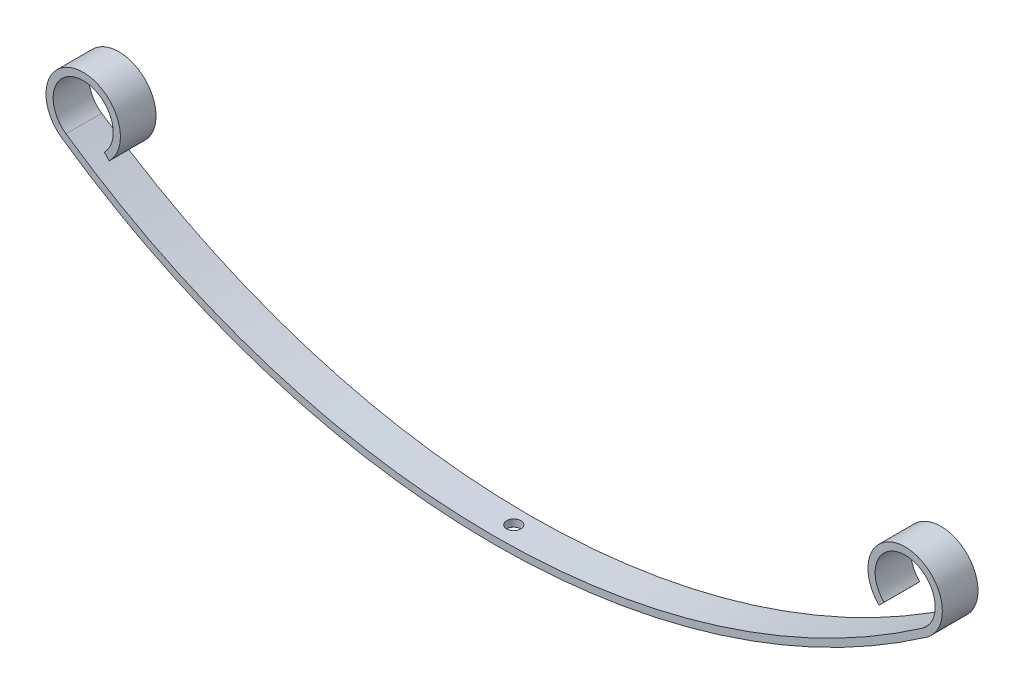
ISO-10303-21;
HEADER;
FILE_DESCRIPTION(('STEP AP214'),'2;1');
FILE_NAME('part.step','',(''),(''),'','','');
FILE_SCHEMA(('AUTOMOTIVE_DESIGN { 1 0 10303 214 1 1 1 1 }'));
ENDSEC;
DATA;
#1=APPLICATION_CONTEXT('core data for automotive mechanical design processes');
#2=APPLICATION_PROTOCOL_DEFINITION('international standard','automotive_design',2000,#1);
#3=PRODUCT_CONTEXT('',#1,'mechanical');
#4=PRODUCT('Part','Part','',(#3));
#5=PRODUCT_RELATED_PRODUCT_CATEGORY('part','',(#4));
#6=PRODUCT_DEFINITION_FORMATION('','',#4);
#7=PRODUCT_DEFINITION_CONTEXT('part definition',#1,'design');
#8=PRODUCT_DEFINITION('design','',#6,#7);
#9=PRODUCT_DEFINITION_SHAPE('','',#8);
#10=(LENGTH_UNIT() NAMED_UNIT(*) SI_UNIT(.MILLI.,.METRE.));
#11=(NAMED_UNIT(*) PLANE_ANGLE_UNIT() SI_UNIT($,.RADIAN.));
#12=(NAMED_UNIT(*) SI_UNIT($,.STERADIAN.) SOLID_ANGLE_UNIT());
#13=UNCERTAINTY_MEASURE_WITH_UNIT(LENGTH_MEASURE(1.E-05),#10,'distance_accuracy_value','');
#14=(GEOMETRIC_REPRESENTATION_CONTEXT(3) GLOBAL_UNCERTAINTY_ASSIGNED_CONTEXT((#13)) GLOBAL_UNIT_ASSIGNED_CONTEXT((#10,
#11,#12)) REPRESENTATION_CONTEXT('',''));
#15=CARTESIAN_POINT('',(0.,0.,0.));
#16=DIRECTION('',(0.,0.,1.));
#17=DIRECTION('',(1.,0.,0.));
#18=AXIS2_PLACEMENT_3D('',#15,#16,#17);
#19=CARTESIAN_POINT('',(-575.940503999726,-827.131576476279,50.));
#20=DIRECTION('',(0.,0.,-1.));
#21=DIRECTION('',(-1.,0.,0.));
#22=AXIS2_PLACEMENT_3D('',#19,#20,#21);
#23=CYLINDRICAL_SURFACE('',#22,52.1041180004789);
#24=CARTESIAN_POINT('',(-575.940503999726,-827.131576476279,0.));
#25=DIRECTION('',(0.,0.,1.));
#26=DIRECTION('',(1.,0.,0.));
#27=AXIS2_PLACEMENT_3D('',#24,#25,#26);
#28=CIRCLE('',#27,52.1041180004789);
#29=CARTESIAN_POINT('',(-539.348809345901,-864.224527221252,0.));
#30=VERTEX_POINT('',#29);
#31=CARTESIAN_POINT('',(-605.714285714286,-869.890915047187,0.));
#32=VERTEX_POINT('',#31);
#33=EDGE_CURVE('E144',#30,#32,#28,.T.);
#34=ORIENTED_EDGE('',*,*,#33,.T.);
#35=DIRECTION('',(0.,0.,-1.));
#36=VECTOR('',#35,1.);
#37=CARTESIAN_POINT('',(-605.714285714286,-869.890915047187,50.));
#38=LINE('',#37,#36);
#39=CARTESIAN_POINT('',(-605.714285714286,-869.890915047187,50.));
#40=VERTEX_POINT('',#39);
#41=EDGE_CURVE('E11',#40,#32,#38,.T.);
#42=ORIENTED_EDGE('',*,*,#41,.F.);
#43=CARTESIAN_POINT('',(-575.940503999726,-827.131576476279,50.));
#44=DIRECTION('',(0.,0.,1.));
#45=DIRECTION('',(1.,0.,0.));
#46=AXIS2_PLACEMENT_3D('',#43,#44,#45);
#47=CIRCLE('',#46,52.1041180004789);
#48=CARTESIAN_POINT('',(-539.348809345901,-864.224527221252,50.));
#49=VERTEX_POINT('',#48);
#50=EDGE_CURVE('E171',#49,#40,#47,.T.);
#51=ORIENTED_EDGE('',*,*,#50,.F.);
#52=DIRECTION('',(0.,0.,-1.));
#53=VECTOR('',#52,1.);
#54=CARTESIAN_POINT('',(-539.348809345901,-864.224527221252,50.));
#55=LINE('',#54,#53);
#56=EDGE_CURVE('E140',#49,#30,#55,.T.);
#57=ORIENTED_EDGE('',*,*,#56,.T.);
#58=EDGE_LOOP('',(#34,#42,#51,#57));
#59=FACE_BOUND('',#58,.T.);
#60=ADVANCED_FACE('F39',(#59),#23,.T.);
#61=CARTESIAN_POINT('',(0.,0.,50.));
#62=DIRECTION('',(0.,0.,-1.));
#63=DIRECTION('',(-1.,0.,0.));
#64=AXIS2_PLACEMENT_3D('',#61,#62,#63);
#65=CYLINDRICAL_SURFACE('',#64,1060.);
#66=CARTESIAN_POINT('',(0.,-1060.,32.5));
#67=CARTESIAN_POINT('',(0.280946584348206,-1060.00000005311,32.5000020220934));
#68=CARTESIAN_POINT('',(0.56186000698558,-1059.99988806992,32.4881554885509));
#69=CARTESIAN_POINT('',(1.12178384017967,-1059.99944337889,32.4408520981594));
#70=CARTESIAN_POINT('',(1.40079373100566,-1059.99911061302,32.4053890348243));
#71=CARTESIAN_POINT('',(1.95512691926414,-1059.99823320531,32.3110456503398));
#72=CARTESIAN_POINT('',(2.23044597331775,-1059.99768833816,32.2521404262339));
#73=CARTESIAN_POINT('',(2.77514481562961,-1059.996402234,32.1113319083847));
#74=CARTESIAN_POINT('',(3.04452449859756,-1059.99566099352,32.0294282072885));
#75=CARTESIAN_POINT('',(3.5752887959038,-1059.9940036209,31.8432523644932));
#76=CARTESIAN_POINT('',(3.83667730994195,-1059.99308757571,31.7389913389032));
#77=CARTESIAN_POINT('',(4.34974481181648,-1059.99110634953,31.5088165525777));
#78=CARTESIAN_POINT('',(4.60142364640466,-1059.9900411662,31.382902450262));
#79=CARTESIAN_POINT('',(5.09321722992586,-1059.98779219393,31.1103516290593));
#80=CARTESIAN_POINT('',(5.33333480554242,-1059.98660843421,30.9637200103765));
#81=CARTESIAN_POINT('',(5.8003606571583,-1059.9841557098,30.6507563684889));
#82=CARTESIAN_POINT('',(6.02726921450707,-1059.98288674693,30.4844247651191));
#83=CARTESIAN_POINT('',(6.46630145618245,-1059.98029941738,30.1332156423847));
#84=CARTESIAN_POINT('',(6.67842302462288,-1059.97898104367,29.9483354780811));
#85=CARTESIAN_POINT('',(7.08633806907873,-1059.97633248349,29.561363072658));
#86=CARTESIAN_POINT('',(7.28213152827135,-1059.975002297,29.3592708138054));
#87=CARTESIAN_POINT('',(7.65600563784012,-1059.97236781821,28.9393027189671));
#88=CARTESIAN_POINT('',(7.8340855975412,-1059.97106352692,28.7214262681048));
#89=CARTESIAN_POINT('',(8.17125798978058,-1059.96851791795,28.2714456419832));
#90=CARTESIAN_POINT('',(8.33035042594166,-1059.96727660027,28.0393414694386));
#91=CARTESIAN_POINT('',(8.62841675297272,-1059.96489217678,27.5625553311994));
#92=CARTESIAN_POINT('',(8.76739064149245,-1059.963749071,27.3178733640354));
#93=CARTESIAN_POINT('',(9.02423174592911,-1059.96159352313,26.8176711092513));
#94=CARTESIAN_POINT('',(9.14209896111197,-1059.96058108105,26.5621508212542));
#95=CARTESIAN_POINT('',(9.35588838032539,-1059.95871560566,26.0420890694925));
#96=CARTESIAN_POINT('',(9.45181063206887,-1059.957862572,25.7775476253433));
#97=CARTESIAN_POINT('',(9.62102834409218,-1059.95634012899,25.2413238128445));
#98=CARTESIAN_POINT('',(9.69432380511083,-1059.95567071964,24.969641444728));
#99=CARTESIAN_POINT('',(9.81776495300685,-1059.95453454668,24.4210751591308));
#100=CARTESIAN_POINT('',(9.86791129425824,-1059.95406777733,24.1441913889122));
#101=CARTESIAN_POINT('',(9.94470064402974,-1059.95335010869,23.5871833899874));
#102=CARTESIAN_POINT('',(9.9713436529791,-1059.95309920939,23.3070591613404));
#103=CARTESIAN_POINT('',(10.0009368315469,-1059.9528204042,22.7455624456118));
#104=CARTESIAN_POINT('',(10.0038870484492,-1059.95279249787,22.4641899610224));
#105=CARTESIAN_POINT('',(9.98607378550728,-1059.9529604699,21.9021967050847));
#106=CARTESIAN_POINT('',(9.96531030609027,-1059.95315634825,21.6215759337227));
#107=CARTESIAN_POINT('',(9.90021834436419,-1059.95376631874,21.0630900864696));
#108=CARTESIAN_POINT('',(9.85589060514177,-1059.95418040401,20.7852249239632));
#109=CARTESIAN_POINT('',(9.74398580294951,-1059.95521502892,20.2342167248068));
#110=CARTESIAN_POINT('',(9.67640874052277,-1059.95583556856,19.9610736880465));
#111=CARTESIAN_POINT('',(9.51848572371814,-1059.95726548699,19.4214512112829));
#112=CARTESIAN_POINT('',(9.42813974349648,-1059.958074866,19.1549717788434));
#113=CARTESIAN_POINT('',(9.22532131348973,-1059.95985948679,18.6305711663604));
#114=CARTESIAN_POINT('',(9.11284886315724,-1059.96083472857,18.3726499865285));
#115=CARTESIAN_POINT('',(8.8665751949722,-1059.96292340768,17.8671953037659));
#116=CARTESIAN_POINT('',(8.73277363926302,-1059.96403684719,17.6196619654586));
#117=CARTESIAN_POINT('',(8.44479429713416,-1059.96637030295,17.1367468776052));
#118=CARTESIAN_POINT('',(8.29061651058448,-1059.9675903192,16.9013651281366));
#119=CARTESIAN_POINT('',(7.96298078682747,-1059.97010229707,16.4444264090993));
#120=CARTESIAN_POINT('',(7.78952285308146,-1059.97139425868,16.2228694370487));
#121=CARTESIAN_POINT('',(7.4245598551457,-1059.97401345524,15.7951550835713));
#122=CARTESIAN_POINT('',(7.23305479046283,-1059.97534069018,15.5889977025654));
#123=CARTESIAN_POINT('',(6.83335098118503,-1059.97799281239,15.1935401938286));
#124=CARTESIAN_POINT('',(6.62515158345991,-1059.97931769955,15.0042407262397));
#125=CARTESIAN_POINT('',(6.19354566028855,-1059.98192746531,14.6438538228687));
#126=CARTESIAN_POINT('',(5.97013913441568,-1059.98321234391,14.4727663875976));
#127=CARTESIAN_POINT('',(5.50970705525377,-1059.98570561966,14.1500198242902));
#128=CARTESIAN_POINT('',(5.27268149991302,-1059.98691401681,13.998360699181));
#129=CARTESIAN_POINT('',(4.7866963677902,-1059.98922002738,13.7155490281529));
#130=CARTESIAN_POINT('',(4.53773679115306,-1059.9903176408,13.584396481985));
#131=CARTESIAN_POINT('',(4.02965324006816,-1059.99237092721,13.3435303648615));
#132=CARTESIAN_POINT('',(3.77052925630749,-1059.99332660007,13.2338168135494));
#133=CARTESIAN_POINT('',(3.24395929545183,-1059.99506887533,13.0366089692603));
#134=CARTESIAN_POINT('',(2.97651331831506,-1059.99585547773,12.9491146763949));
#135=CARTESIAN_POINT('',(2.43520087718173,-1059.99723728213,12.7969675543235));
#136=CARTESIAN_POINT('',(2.16133441486457,-1059.99783248418,12.7323147191431));
#137=CARTESIAN_POINT('',(1.6091280955505,-1059.99881459158,12.6263102664249));
#138=CARTESIAN_POINT('',(1.33078823870042,-1059.99920149693,12.5849586481223));
#139=CARTESIAN_POINT('',(0.77162494237483,-1059.99975601669,12.5258518556675));
#140=CARTESIAN_POINT('',(0.490801599132531,-1059.99992363955,12.5080957712042));
#141=CARTESIAN_POINT('',(-0.071342710693692,-1060.00003486381,12.4963033565812));
#142=CARTESIAN_POINT('',(-0.352663677264907,-1059.9999784652,12.5022670258157));
#143=CARTESIAN_POINT('',(-0.91380311134412,-1059.99964324747,12.5378717052939));
#144=CARTESIAN_POINT('',(-1.19362157895722,-1059.99936442837,12.5675127138814));
#145=CARTESIAN_POINT('',(-1.74976663636781,-1059.99859228428,12.6502612785661));
#146=CARTESIAN_POINT('',(-2.02609322617277,-1059.9980989593,12.7033688346131));
#147=CARTESIAN_POINT('',(-2.57328511112292,-1059.99691181759,12.8326716784161));
#148=CARTESIAN_POINT('',(-2.84415050369338,-1059.99621800443,12.9088665539154));
#149=CARTESIAN_POINT('',(-3.3784995128294,-1059.99464957655,13.0838025768682));
#150=CARTESIAN_POINT('',(-3.64198312951571,-1059.99377496182,13.1825437239529));
#151=CARTESIAN_POINT('',(-4.15969558860484,-1059.99186975591,13.4018702365201));
#152=CARTESIAN_POINT('',(-4.41392443068157,-1059.99083916473,13.5224556027723));
#153=CARTESIAN_POINT('',(-4.91132018727455,-1059.98865125796,13.7846132433663));
#154=CARTESIAN_POINT('',(-5.15448710144171,-1059.98749394237,13.9261855183705));
#155=CARTESIAN_POINT('',(-5.62803778503295,-1059.98508539847,14.2293151696099));
#156=CARTESIAN_POINT('',(-5.85842116327858,-1059.98383416729,14.3908731569236));
#157=CARTESIAN_POINT('',(-6.30475909014677,-1059.98127333946,14.7328222943886));
#158=CARTESIAN_POINT('',(-6.52071363850222,-1059.97996374281,14.9132134448885));
#159=CARTESIAN_POINT('',(-6.93665894786419,-1059.97732335599,15.2915466762952));
#160=CARTESIAN_POINT('',(-7.13664969940709,-1059.97599256581,15.4894887676064));
#161=CARTESIAN_POINT('',(-7.5192456514605,-1059.97334756745,15.9015167263907));
#162=CARTESIAN_POINT('',(-7.70185085167683,-1059.97203335926,16.1156025941369));
#163=CARTESIAN_POINT('',(-8.04838312062709,-1059.96945878853,16.5584033356973));
#164=CARTESIAN_POINT('',(-8.21230959677797,-1059.96819842769,16.7871186732725));
#165=CARTESIAN_POINT('',(-8.52031230477512,-1059.96576737509,17.2575463569666));
#166=CARTESIAN_POINT('',(-8.66438853614721,-1059.96459668332,17.4992587033961));
#167=CARTESIAN_POINT('',(-8.93166623202528,-1059.96237820449,17.993961789564));
#168=CARTESIAN_POINT('',(-9.05486772032143,-1059.96133041729,18.2469525164484));
#169=CARTESIAN_POINT('',(-9.27952011671571,-1059.95938749238,18.7624140517701));
#170=CARTESIAN_POINT('',(-9.38097102538005,-1059.95849235466,19.0248848599605));
#171=CARTESIAN_POINT('',(-9.56139929543442,-1059.95688015591,19.5574359154949));
#172=CARTESIAN_POINT('',(-9.6403770458609,-1059.95616309178,19.8275160310241));
#173=CARTESIAN_POINT('',(-9.77529971900456,-1059.95492737776,20.3733699088328));
#174=CARTESIAN_POINT('',(-9.83124464187078,-1059.95440872787,20.6491436710755));
#175=CARTESIAN_POINT('',(-9.91970387457964,-1059.95358456646,21.2044245879638));
#176=CARTESIAN_POINT('',(-9.95221814740845,-1059.95327905529,21.4839317485063));
#177=CARTESIAN_POINT('',(-9.99358469808434,-1059.95288984673,22.0446917365487));
#178=CARTESIAN_POINT('',(-10.0024369765644,-1059.95280614934,22.3259445640019));
#179=CARTESIAN_POINT('',(-9.99641670711445,-1059.95286294336,22.8881846935362));
#180=CARTESIAN_POINT('',(-9.98154512565411,-1059.95300342563,23.1691720059672));
#181=CARTESIAN_POINT('',(-9.92818470658138,-1059.95350457372,23.7288949073403));
#182=CARTESIAN_POINT('',(-9.88969586959782,-1059.95386523952,24.0076304963423));
#183=CARTESIAN_POINT('',(-9.78937454164448,-1059.95479651649,24.5608688730521));
#184=CARTESIAN_POINT('',(-9.72754200392926,-1059.95536712809,24.8353716522825));
#185=CARTESIAN_POINT('',(-9.58097296960598,-1059.95670209778,25.3781923414521));
#186=CARTESIAN_POINT('',(-9.4962364731259,-1059.95746645588,25.6465102514259));
#187=CARTESIAN_POINT('',(-9.30446026916011,-1059.95916723565,26.1750586300429));
#188=CARTESIAN_POINT('',(-9.19742015033898,-1059.9601036605,26.4352889494288));
#189=CARTESIAN_POINT('',(-8.96179870770165,-1059.96212198139,26.945807068741));
#190=CARTESIAN_POINT('',(-8.83321737976848,-1059.96320387745,27.1960948667672));
#191=CARTESIAN_POINT('',(-8.55543309241778,-1059.96548238426,27.6849392266996));
#192=CARTESIAN_POINT('',(-8.40623093049,-1059.96667899057,27.9234962417984));
#193=CARTESIAN_POINT('',(-8.0882619807592,-1059.96915298728,28.3871935515233));
#194=CARTESIAN_POINT('',(-7.919495212128,-1059.97043037761,28.6123338592964));
#195=CARTESIAN_POINT('',(-7.56361013005285,-1059.97302958753,29.047581186366));
#196=CARTESIAN_POINT('',(-7.37649321444006,-1059.97435140374,29.2576893486376));
#197=CARTESIAN_POINT('',(-6.98522273545511,-1059.97700207468,29.661402395243));
#198=CARTESIAN_POINT('',(-6.78106880825639,-1059.97833092956,29.855006926962));
#199=CARTESIAN_POINT('',(-6.35712640594123,-1059.98095826128,30.2243772288435));
#200=CARTESIAN_POINT('',(-6.13733409524922,-1059.98225673057,30.4001385968402));
#201=CARTESIAN_POINT('',(-5.68372603551286,-1059.98478606453,30.7325157844114));
#202=CARTESIAN_POINT('',(-5.44991050778364,-1059.98601693026,30.8891319060188));
#203=CARTESIAN_POINT('',(-4.96979190737855,-1059.98837673623,31.1821832629788));
#204=CARTESIAN_POINT('',(-4.72348250297735,-1059.98950562395,31.3186081256654));
#205=CARTESIAN_POINT('',(-4.22024566651422,-1059.99162866155,31.5702075542553));
#206=CARTESIAN_POINT('',(-3.96331842261025,-1059.99262281379,31.6853824965295));
#207=CARTESIAN_POINT('',(-3.44094295376618,-1059.99444717367,31.8935548674749));
#208=CARTESIAN_POINT('',(-3.17550408838321,-1059.99527755464,31.9865757683566));
#209=CARTESIAN_POINT('',(-2.63782431812397,-1059.9967519617,32.1499132730886));
#210=CARTESIAN_POINT('',(-2.3655852197896,-1059.99739603671,32.2202358392719));
#211=CARTESIAN_POINT('',(-1.74756596681654,-1059.99861495653,32.3523694255879));
#212=CARTESIAN_POINT('',(-1.4003776449176,-1059.99913247613,32.4076838557039));
#213=CARTESIAN_POINT('',(-0.702108958754502,-1059.99982496467,32.4814978791332));
#214=CARTESIAN_POINT('',(-0.351028594601317,-1059.99999993364,32.4999974734963));
#215=CARTESIAN_POINT('',(0.,-1060.,32.5));
#216=B_SPLINE_CURVE_WITH_KNOTS('',3,(#66,#67,#68,#69,#70,#71,#72,#73,#74,#75,#76,#77,#78,#79,
#80,#81,#82,#83,#84,#85,#86,#87,#88,#89,#90,#91,#92,#93,#94,#95,#96,#97,#98,#99,#100,#101,#102,
#103,#104,#105,#106,#107,#108,#109,#110,#111,#112,#113,#114,#115,#116,#117,#118,#119,#120,#121,
#122,#123,#124,#125,#126,#127,#128,#129,#130,#131,#132,#133,#134,#135,#136,#137,#138,#139,#140,
#141,#142,#143,#144,#145,#146,#147,#148,#149,#150,#151,#152,#153,#154,#155,#156,#157,#158,#159,
#160,#161,#162,#163,#164,#165,#166,#167,#168,#169,#170,#171,#172,#173,#174,#175,#176,#177,#178,
#179,#180,#181,#182,#183,#184,#185,#186,#187,#188,#189,#190,#191,#192,#193,#194,#195,#196,#197,
#198,#199,#200,#201,#202,#203,#204,#205,#206,#207,#208,#209,#210,#211,#212,#213,#214,#215),
.UNSPECIFIED.,.T.,.F.,(4,2,2,2,2,2,2,2,2,2,2,2,2,2,2,2,2,2,2,2,2,2,2,2,2,2,2,2,2,2,2,2,2,2,2,2,
2,2,2,2,2,2,2,2,2,2,2,2,2,2,2,2,2,2,2,2,2,2,2,2,2,2,2,2,2,2,2,2,2,2,2,2,2,2,4),(0.,
0.842533127522199,1.68528776238952,2.52894006813992,3.37260731774666,4.21585606281373,
5.05911811146233,5.90217292778718,6.74520978063723,7.58836701797004,8.43152512399476,
9.27471609310212,10.1179069013305,10.9610978080598,11.8042887441143,12.6474778468784,
13.4906669221103,14.3338321608067,15.1769973841043,16.0201609246924,16.863324450092,
17.7064613883464,18.5495983069049,19.3927361824673,20.2358740788884,21.0790253320831,
21.9221765906567,22.765327697861,23.6084788281037,24.4516629609466,25.2948471174444,
26.1380314009692,26.9812156742553,27.8244007201085,28.6675857701942,29.5107705997325,
30.3539554015985,31.1971076726211,32.0402599221108,32.8834121126188,33.7265643013228,
34.5697014352434,35.412838555373,36.2559757052113,37.0991128816574,37.9422758440387,
38.7854388220288,39.628602299857,40.4717657919524,41.3149560259903,42.1581462801711,
43.0013355733934,43.8445248446662,44.6876995184663,45.5308741868106,46.3740501871311,
47.2172261648944,48.0603677939774,48.9035094006108,49.7466526956323,50.5897959859422,
51.4329548273309,52.2761138298647,53.1192402332035,53.9623658103501,54.8054272118197,
55.648506621533,56.4917935281745,57.3350671295189,58.1787724453379,59.0224628163214,
59.8652552805174,60.7078261819167,61.7605288826044,62.8132315532751),.UNSPECIFIED.);
#217=CARTESIAN_POINT('',(0.,-1060.,32.5));
#218=VERTEX_POINT('',#217);
#219=EDGE_CURVE('E149',#218,#218,#216,.T.);
#220=ORIENTED_EDGE('',*,*,#219,.T.);
#221=EDGE_LOOP('',(#220));
#222=FACE_BOUND('',#221,.T.);
#223=CARTESIAN_POINT('',(0.,0.,0.));
#224=DIRECTION('',(0.,0.,1.));
#225=DIRECTION('',(1.,0.,0.));
#226=AXIS2_PLACEMENT_3D('',#223,#224,#225);
#227=CIRCLE('',#226,1060.);
#228=CARTESIAN_POINT('',(605.714285714286,-869.890915047187,0.));
#229=VERTEX_POINT('',#228);
#230=EDGE_CURVE('E148',#32,#229,#227,.T.);
#231=ORIENTED_EDGE('',*,*,#230,.T.);
#232=DIRECTION('',(0.,0.,-1.));
#233=VECTOR('',#232,1.);
#234=CARTESIAN_POINT('',(605.714285714286,-869.890915047187,50.));
#235=LINE('',#234,#233);
#236=CARTESIAN_POINT('',(605.714285714286,-869.890915047187,50.));
#237=VERTEX_POINT('',#236);
#238=EDGE_CURVE('E54',#237,#229,#235,.T.);
#239=ORIENTED_EDGE('',*,*,#238,.F.);
#240=CARTESIAN_POINT('',(0.,0.,50.));
#241=DIRECTION('',(0.,0.,1.));
#242=DIRECTION('',(1.,0.,0.));
#243=AXIS2_PLACEMENT_3D('',#240,#241,#242);
#244=CIRCLE('',#243,1060.);
#245=EDGE_CURVE('E101',#40,#237,#244,.T.);
#246=ORIENTED_EDGE('',*,*,#245,.F.);
#247=ORIENTED_EDGE('',*,*,#41,.T.);
#248=EDGE_LOOP('',(#231,#239,#246,#247));
#249=FACE_BOUND('',#248,.T.);
#250=ADVANCED_FACE('F192',(#222,#249),#65,.T.);
#251=CARTESIAN_POINT('',(575.940503999726,-827.131576476279,50.));
#252=DIRECTION('',(0.,0.,-1.));
#253=DIRECTION('',(-1.,0.,0.));
#254=AXIS2_PLACEMENT_3D('',#251,#252,#253);
#255=CYLINDRICAL_SURFACE('',#254,52.1041180004789);
#256=CARTESIAN_POINT('',(575.940503999726,-827.131576476279,0.));
#257=DIRECTION('',(0.,0.,-1.));
#258=DIRECTION('',(-1.,0.,0.));
#259=AXIS2_PLACEMENT_3D('',#256,#257,#258);
#260=CIRCLE('',#259,52.1041180004789);
#261=CARTESIAN_POINT('',(539.348809345901,-864.224527221252,0.));
#262=VERTEX_POINT('',#261);
#263=EDGE_CURVE('E153',#262,#229,#260,.T.);
#264=ORIENTED_EDGE('',*,*,#263,.F.);
#265=DIRECTION('',(0.,0.,-1.));
#266=VECTOR('',#265,1.);
#267=CARTESIAN_POINT('',(539.348809345901,-864.224527221252,50.));
#268=LINE('',#267,#266);
#269=CARTESIAN_POINT('',(539.348809345901,-864.224527221252,50.));
#270=VERTEX_POINT('',#269);
#271=EDGE_CURVE('E182',#270,#262,#268,.T.);
#272=ORIENTED_EDGE('',*,*,#271,.F.);
#273=CARTESIAN_POINT('',(575.940503999726,-827.131576476279,50.));
#274=DIRECTION('',(0.,0.,-1.));
#275=DIRECTION('',(-1.,0.,0.));
#276=AXIS2_PLACEMENT_3D('',#273,#274,#275);
#277=CIRCLE('',#276,52.1041180004789);
#278=EDGE_CURVE('E191',#270,#237,#277,.T.);
#279=ORIENTED_EDGE('',*,*,#278,.T.);
#280=ORIENTED_EDGE('',*,*,#238,.T.);
#281=EDGE_LOOP('',(#264,#272,#279,#280));
#282=FACE_BOUND('',#281,.T.);
#283=ADVANCED_FACE('F189',(#282),#255,.T.);
#284=CARTESIAN_POINT('',(539.348809345901,-864.224527221252,50.));
#285=DIRECTION('',(-0.711900559273121,0.702280281445106,0.));
#286=DIRECTION('',(-0.702280281445106,-0.711900559273121,0.));
#287=AXIS2_PLACEMENT_3D('',#284,#285,#286);
#288=PLANE('',#287);
#289=DIRECTION('',(0.702280281445106,0.711900559273121,0.));
#290=VECTOR('',#289,1.);
#291=CARTESIAN_POINT('',(539.348809345901,-864.224527221252,0.));
#292=LINE('',#291,#290);
#293=CARTESIAN_POINT('',(546.371612160352,-857.105521628521,0.));
#294=VERTEX_POINT('',#293);
#295=EDGE_CURVE('E157',#262,#294,#292,.T.);
#296=ORIENTED_EDGE('',*,*,#295,.T.);
#297=DIRECTION('',(0.,0.,-1.));
#298=VECTOR('',#297,1.);
#299=CARTESIAN_POINT('',(546.371612160352,-857.105521628521,50.));
#300=LINE('',#299,#298);
#301=CARTESIAN_POINT('',(546.371612160352,-857.105521628521,50.));
#302=VERTEX_POINT('',#301);
#303=EDGE_CURVE('E178',#302,#294,#300,.T.);
#304=ORIENTED_EDGE('',*,*,#303,.F.);
#305=DIRECTION('',(0.702280281445106,0.711900559273121,0.));
#306=VECTOR('',#305,1.);
#307=CARTESIAN_POINT('',(539.348809345901,-864.224527221252,50.));
#308=LINE('',#307,#306);
#309=EDGE_CURVE('E206',#270,#302,#308,.T.);
#310=ORIENTED_EDGE('',*,*,#309,.F.);
#311=ORIENTED_EDGE('',*,*,#271,.T.);
#312=EDGE_LOOP('',(#296,#304,#310,#311));
#313=FACE_BOUND('',#312,.T.);
#314=ADVANCED_FACE('F201',(#313),#288,.F.);
#315=CARTESIAN_POINT('',(575.940503999726,-827.131576476279,50.));
#316=DIRECTION('',(0.,0.,-1.));
#317=DIRECTION('',(-1.,0.,0.));
#318=AXIS2_PLACEMENT_3D('',#315,#316,#317);
#319=CYLINDRICAL_SURFACE('',#318,42.1041180004789);
#320=CARTESIAN_POINT('',(575.940503999726,-827.131576476279,0.));
#321=DIRECTION('',(0.,0.,-1.));
#322=DIRECTION('',(-1.,0.,0.));
#323=AXIS2_PLACEMENT_3D('',#320,#321,#322);
#324=CIRCLE('',#323,42.1041180004789);
#325=CARTESIAN_POINT('',(600.,-861.684396980704,0.));
#326=VERTEX_POINT('',#325);
#327=EDGE_CURVE('E160',#294,#326,#324,.T.);
#328=ORIENTED_EDGE('',*,*,#327,.T.);
#329=DIRECTION('',(0.,0.,-1.));
#330=VECTOR('',#329,1.);
#331=CARTESIAN_POINT('',(600.,-861.684396980704,50.));
#332=LINE('',#331,#330);
#333=CARTESIAN_POINT('',(600.,-861.684396980704,50.));
#334=VERTEX_POINT('',#333);
#335=EDGE_CURVE('E127',#334,#326,#332,.T.);
#336=ORIENTED_EDGE('',*,*,#335,.F.);
#337=CARTESIAN_POINT('',(575.940503999726,-827.131576476279,50.));
#338=DIRECTION('',(0.,0.,-1.));
#339=DIRECTION('',(-1.,0.,0.));
#340=AXIS2_PLACEMENT_3D('',#337,#338,#339);
#341=CIRCLE('',#340,42.1041180004789);
#342=EDGE_CURVE('E132',#302,#334,#341,.T.);
#343=ORIENTED_EDGE('',*,*,#342,.F.);
#344=ORIENTED_EDGE('',*,*,#303,.T.);
#345=EDGE_LOOP('',(#328,#336,#343,#344));
#346=FACE_BOUND('',#345,.T.);
#347=ADVANCED_FACE('F204',(#346),#319,.F.);
#348=CARTESIAN_POINT('',(0.,0.,50.));
#349=DIRECTION('',(0.,0.,-1.));
#350=DIRECTION('',(-1.,0.,0.));
#351=AXIS2_PLACEMENT_3D('',#348,#349,#350);
#352=CYLINDRICAL_SURFACE('',#351,1050.);
#353=CARTESIAN_POINT('',(0.,-1050.,32.5));
#354=CARTESIAN_POINT('',(0.280946455707338,-1050.00000005362,32.5000020222119));
#355=CARTESIAN_POINT('',(0.561859748180041,-1049.99988700402,32.4881554994629));
#356=CARTESIAN_POINT('',(1.12178332012285,-1049.99943807825,32.4408521530473));
#357=CARTESIAN_POINT('',(1.4007930798701,-1049.9991021435,32.4053891229936));
#358=CARTESIAN_POINT('',(1.95512600058904,-1049.99821638034,32.3110458293668));
#359=CARTESIAN_POINT('',(2.23044491824481,-1049.99766632449,32.2521406632368));
#360=CARTESIAN_POINT('',(2.77514348860674,-1049.99636797292,32.1113322871698));
#361=CARTESIAN_POINT('',(3.04452303602068,-1049.99561967369,32.0294286698729));
#362=CARTESIAN_POINT('',(3.57528705945367,-1049.99394651809,31.8432530240047));
#363=CARTESIAN_POINT('',(3.83667543534891,-1049.99302174949,31.738992112036));
#364=CARTESIAN_POINT('',(4.34974266843324,-1049.99102165623,31.5088175820089));
#365=CARTESIAN_POINT('',(4.60142137237703,-1049.9899463292,31.382903622377));
#366=CARTESIAN_POINT('',(5.0932147093245,-1049.98767593996,31.1103531140938));
#367=CARTESIAN_POINT('',(5.33333216891936,-1049.98648090724,30.9637216654786));
#368=CARTESIAN_POINT('',(5.8003578070967,-1049.98400482525,30.6507583901235));
#369=CARTESIAN_POINT('',(6.02726626701966,-1049.98272377781,30.4844269832052));
#370=CARTESIAN_POINT('',(6.46629845526264,-1049.98011180774,30.1332181828166));
#371=CARTESIAN_POINT('',(6.67842005981523,-1049.97878087799,29.9483381345543));
#372=CARTESIAN_POINT('',(7.08633518849065,-1049.97610709293,29.5613659614718));
#373=CARTESIAN_POINT('',(7.28212869578543,-1049.97476423762,29.3592738189131));
#374=CARTESIAN_POINT('',(7.65600291613599,-1049.97210466749,28.9393059528157));
#375=CARTESIAN_POINT('',(7.83408293849946,-1049.97078795369,28.7214296143845));
#376=CARTESIAN_POINT('',(8.17125547160761,-1049.96821809919,28.2714492050629));
#377=CARTESIAN_POINT('',(8.33034798597325,-1049.96696495847,28.0393451368858));
#378=CARTESIAN_POINT('',(8.62841453809133,-1049.96455782356,27.5625591096344));
#379=CARTESIAN_POINT('',(8.76738856629714,-1049.96340382943,27.3178771445919));
#380=CARTESIAN_POINT('',(9.02422994840819,-1049.96122774919,26.8176748708692));
#381=CARTESIAN_POINT('',(9.14209730157277,-1049.96020566309,26.5621545618088));
#382=CARTESIAN_POINT('',(9.35588699117922,-1049.95832241782,26.042092745131));
#383=CARTESIAN_POINT('',(9.45180937539751,-1049.95746125831,25.7775512571551));
#384=CARTESIAN_POINT('',(9.62102734322767,-1049.95592431251,25.2413273347973));
#385=CARTESIAN_POINT('',(9.69432292759202,-1049.95524852622,24.9696449006529));
#386=CARTESIAN_POINT('',(9.8177642735964,-1049.95410152988,24.4210786221034));
#387=CARTESIAN_POINT('',(9.86791070297968,-1049.95363031393,24.1441949279699));
#388=CARTESIAN_POINT('',(9.9447002402635,-1049.95290580801,23.5871870686906));
#389=CARTESIAN_POINT('',(9.97134334860137,-1049.95265251804,23.307062903605));
#390=CARTESIAN_POINT('',(10.0009367352661,-1049.95237105535,22.7455663053535));
#391=CARTESIAN_POINT('',(10.0038870609635,-1049.95234288218,22.4641938746844));
#392=CARTESIAN_POINT('',(9.98607402424438,-1049.95251245194,21.9022007182391));
#393=CARTESIAN_POINT('',(9.96531066226272,-1049.95271019485,21.6215799924492));
#394=CARTESIAN_POINT('',(9.90021896407187,-1049.95332597264,21.0630944007939));
#395=CARTESIAN_POINT('',(9.85589138534057,-1049.95374400044,20.785229446636));
#396=CARTESIAN_POINT('',(9.74398694201719,-1049.95478847653,20.2342216524243));
#397=CARTESIAN_POINT('',(9.67641007797922,-1049.95541492481,19.961078812258));
#398=CARTESIAN_POINT('',(9.51848749602539,-1049.95685845891,19.4214567131349));
#399=CARTESIAN_POINT('',(9.42814175223163,-1049.95767554494,19.154977461752));
#400=CARTESIAN_POINT('',(9.22532383301546,-1049.95947715935,18.6305771915839));
#401=CARTESIAN_POINT('',(9.1128516570354,-1049.96046168774,18.3726561730145));
#402=CARTESIAN_POINT('',(8.86657853621652,-1049.96257025651,17.8672017090742));
#403=CARTESIAN_POINT('',(8.73277724692363,-1049.96369429916,17.6196684315415));
#404=CARTESIAN_POINT('',(8.44479845952952,-1049.96604997631,17.1367534412086));
#405=CARTESIAN_POINT('',(8.29062096129553,-1049.96728161083,16.9013717284877));
#406=CARTESIAN_POINT('',(7.96298583213824,-1049.9698175106,16.4444330524316));
#407=CARTESIAN_POINT('',(7.78952820459306,-1049.97112177585,16.2228760866743));
#408=CARTESIAN_POINT('',(7.42456583273651,-1049.97376591587,15.7951617109738));
#409=CARTESIAN_POINT('',(7.23306108792254,-1049.97510579064,15.5890043014595));
#410=CARTESIAN_POINT('',(6.83335777653577,-1049.97778317147,15.1935465486495));
#411=CARTESIAN_POINT('',(6.62515854437604,-1049.97912067743,15.004246878085));
#412=CARTESIAN_POINT('',(6.19355293096096,-1049.98175530006,14.6438595542777));
#413=CARTESIAN_POINT('',(5.9701465492709,-1049.98305241673,14.4727719015556));
#414=CARTESIAN_POINT('',(5.50971473309046,-1049.98556944054,14.1500248897845));
#415=CARTESIAN_POINT('',(5.27268929654317,-1049.98678934767,13.9983655336698));
#416=CARTESIAN_POINT('',(4.78670437328063,-1049.9891173234,13.715553389478));
#417=CARTESIAN_POINT('',(4.53774488671307,-1049.99022539201,13.5844006011471));
#418=CARTESIAN_POINT('',(4.02966147984637,-1049.99229823722,13.3435339897682));
#419=CARTESIAN_POINT('',(3.77053755004656,-1049.99326301369,13.2338201867596));
#420=CARTESIAN_POINT('',(3.24396766462543,-1049.99502188616,13.0366118365534));
#421=CARTESIAN_POINT('',(2.97652170896151,-1049.99581598215,12.9491172894694));
#422=CARTESIAN_POINT('',(2.43520928030631,-1049.99721095097,12.7969696614956));
#423=CARTESIAN_POINT('',(2.16134280902102,-1049.99781182386,12.7323165745366));
#424=CARTESIAN_POINT('',(1.60913644284852,-1049.99880328918,12.6263116248171));
#425=CARTESIAN_POINT('',(1.33079654811093,-1049.99919388161,12.5849597612773));
#426=CARTESIAN_POINT('',(0.771633357530493,-1049.99975368681,12.5258525104119));
#427=CARTESIAN_POINT('',(0.490810159763393,-1049.99992290827,12.5080961953549));
#428=CARTESIAN_POINT('',(-0.0713338800672139,-1050.00003519641,12.4963032972642));
#429=CARTESIAN_POINT('',(-0.352654722117769,-1049.99997826308,12.5022667136131));
#430=CARTESIAN_POINT('',(-0.913793926858859,-1049.99963985779,12.5378708665327));
#431=CARTESIAN_POINT('',(-1.19361228965781,-1049.99935838584,12.5675116013949));
#432=CARTESIAN_POINT('',(-1.74975715742404,-1049.99857889322,12.6502595985436));
#433=CARTESIAN_POINT('',(-2.02608366239895,-1049.99808087256,12.7033668607789));
#434=CARTESIAN_POINT('',(-2.57327530424166,-1049.99688243023,12.8326690749302));
#435=CARTESIAN_POINT('',(-2.84414054040393,-1049.99618201226,12.9088636066787));
#436=CARTESIAN_POINT('',(-3.37848926434953,-1049.99459865282,13.0837989071557));
#437=CARTESIAN_POINT('',(-3.64197275225591,-1049.99371571136,13.1825396755083));
#438=CARTESIAN_POINT('',(-4.15968498704243,-1049.99179236639,13.4018653973968));
#439=CARTESIAN_POINT('',(-4.41391373356709,-1049.99075196287,13.5224503517717));
#440=CARTESIAN_POINT('',(-4.91130933729704,-1049.98854322427,13.7846071377631));
#441=CARTESIAN_POINT('',(-5.15447619414652,-1049.98737488918,13.9261789700546));
#442=CARTESIAN_POINT('',(-5.62802694689876,-1049.98494341075,14.2293077982303));
#443=CARTESIAN_POINT('',(-5.85841044410617,-1049.98368026445,14.3908654169366));
#444=CARTESIAN_POINT('',(-6.30474864196582,-1049.9810950499,14.7328138176308));
#445=CARTESIAN_POINT('',(-6.52070334234587,-1049.97977298164,14.913204599974));
#446=CARTESIAN_POINT('',(-6.93664899281287,-1049.97710744908,15.2915371012534));
#447=CARTESIAN_POINT('',(-7.13663993337884,-1049.97576398476,15.4894788306572));
#448=CARTESIAN_POINT('',(-7.51923630203289,-1049.97309379529,15.9015060774159));
#449=CARTESIAN_POINT('',(-7.7018417298214,-1049.97176707014,16.1155915950492));
#450=CARTESIAN_POINT('',(-8.04837459762378,-1049.96916797675,16.5583917881049));
#451=CARTESIAN_POINT('',(-8.21230143382879,-1049.96789561027,16.7871069360755));
#452=CARTESIAN_POINT('',(-8.52030487628262,-1049.96544139976,17.2575342806249));
#453=CARTESIAN_POINT('',(-8.66438148204797,-1049.96425955572,17.4992464775201));
#454=CARTESIAN_POINT('',(-8.93165993678175,-1049.96201994239,17.9939493072439));
#455=CARTESIAN_POINT('',(-9.05486180957348,-1049.96096217295,18.2469399272004));
#456=CARTESIAN_POINT('',(-9.27951498017355,-1049.95900073701,18.7624012932254));
#457=CARTESIAN_POINT('',(-9.38096627855838,-1049.9580970705,19.0248720390426));
#458=CARTESIAN_POINT('',(-9.56139529837634,-1049.95646951022,19.5574229281056));
#459=CARTESIAN_POINT('',(-9.64037341612568,-1049.95574561326,19.8275029370692));
#460=CARTESIAN_POINT('',(-9.7752968327957,-1049.95449812308,20.373356641444));
#461=CARTESIAN_POINT('',(-9.83124213186879,-1049.95397452985,20.6491303368174));
#462=CARTESIAN_POINT('',(-9.91970212069303,-1049.95314251167,21.2044111568305));
#463=CARTESIAN_POINT('',(-9.95221677353112,-1049.95283408705,21.4839182873511));
#464=CARTESIAN_POINT('',(-9.99358408407556,-1049.95244116423,22.0446782504072));
#465=CARTESIAN_POINT('',(-10.0024367424272,-1049.95235666602,22.3259310828951));
#466=CARTESIAN_POINT('',(-9.99641723171441,-1049.95241399376,22.8881710448297));
#467=CARTESIAN_POINT('',(-9.98154604675068,-1049.95255581032,23.1691581848141));
#468=CARTESIAN_POINT('',(-9.9281864504988,-1049.95306172393,23.7288807736818));
#469=CARTESIAN_POINT('',(-9.88969803985204,-1049.95342582099,24.0076162226263));
#470=CARTESIAN_POINT('',(-9.78937759274778,-1049.95436596004,24.5608543526225));
#471=CARTESIAN_POINT('',(-9.72754550955411,-1049.95494200246,24.8353570251987));
#472=CARTESIAN_POINT('',(-9.5809774109943,-1049.95628967917,25.3781775365604));
#473=CARTESIAN_POINT('',(-9.49624139575051,-1049.95706131345,25.6464953753791));
#474=CARTESIAN_POINT('',(-9.30446617958453,-1049.95877828457,26.1750436494134));
#475=CARTESIAN_POINT('',(-9.1974265673862,-1049.9597236246,26.4352739353937));
#476=CARTESIAN_POINT('',(-8.96180616078762,-1049.96176116161,26.9457920304617));
#477=CARTESIAN_POINT('',(-8.83322536227233,-1049.96285335863,27.19607983765));
#478=CARTESIAN_POINT('',(-8.55544215221276,-1049.96515356032,27.6849242647077));
#479=CARTESIAN_POINT('',(-8.40624053805523,-1049.96636156051,27.9234813377097));
#480=CARTESIAN_POINT('',(-8.08827269766567,-1049.96885911491,28.387178816173));
#481=CARTESIAN_POINT('',(-7.91950649059289,-1049.97014866904,28.6123192347725));
#482=CARTESIAN_POINT('',(-7.56362240619957,-1049.97277263134,29.0475670034904));
#483=CARTESIAN_POINT('',(-7.37650591305131,-1049.97410703613,29.2576754854114));
#484=CARTESIAN_POINT('',(-6.98523625354987,-1049.97678295201,29.6613892080264));
#485=CARTESIAN_POINT('',(-6.78108272336355,-1049.97812446325,29.8549940961005));
#486=CARTESIAN_POINT('',(-6.35714108419319,-1049.98077681915,30.2243651471588));
#487=CARTESIAN_POINT('',(-6.13734913965536,-1049.98208765619,30.4001269080202));
#488=CARTESIAN_POINT('',(-5.6837417747051,-1049.98464108253,30.7325049167762));
#489=CARTESIAN_POINT('',(-5.44992657560482,-1049.98588367293,30.8891214666983));
#490=CARTESIAN_POINT('',(-4.96980851185209,-1049.98826595861,31.182173760291));
#491=CARTESIAN_POINT('',(-4.72349931146328,-1049.98940560087,31.3185991247778));
#492=CARTESIAN_POINT('',(-4.22026282877442,-1049.99154886486,31.5701995710202));
#493=CARTESIAN_POINT('',(-3.96333573463679,-1049.99255248901,31.6853750291534));
#494=CARTESIAN_POINT('',(-3.44096050604891,-1049.99439423178,31.8935484403447));
#495=CARTESIAN_POINT('',(-3.17552173111403,-1049.9952325254,31.9865698653506));
#496=CARTESIAN_POINT('',(-2.63784208614788,-1049.99672098326,32.1499084188951));
#497=CARTESIAN_POINT('',(-2.36560302265293,-1049.99737119689,32.2202315097007));
#498=CARTESIAN_POINT('',(-1.74758095181801,-1049.99860174161,32.3523668752272));
#499=CARTESIAN_POINT('',(-1.40038969678041,-1049.99912419891,32.4076822599008));
#500=CARTESIAN_POINT('',(-0.702115036795107,-1049.9998232946,32.4814975584148));
#501=CARTESIAN_POINT('',(-0.351031631960519,-1049.999999933,32.4999974733251));
#502=CARTESIAN_POINT('',(0.,-1050.,32.5));
#503=B_SPLINE_CURVE_WITH_KNOTS('',3,(#353,#354,#355,#356,#357,#358,#359,#360,#361,#362,#363,
#364,#365,#366,#367,#368,#369,#370,#371,#372,#373,#374,#375,#376,#377,#378,#379,#380,#381,#382,
#383,#384,#385,#386,#387,#388,#389,#390,#391,#392,#393,#394,#395,#396,#397,#398,#399,#400,#401,
#402,#403,#404,#405,#406,#407,#408,#409,#410,#411,#412,#413,#414,#415,#416,#417,#418,#419,#420,
#421,#422,#423,#424,#425,#426,#427,#428,#429,#430,#431,#432,#433,#434,#435,#436,#437,#438,#439,
#440,#441,#442,#443,#444,#445,#446,#447,#448,#449,#450,#451,#452,#453,#454,#455,#456,#457,#458,
#459,#460,#461,#462,#463,#464,#465,#466,#467,#468,#469,#470,#471,#472,#473,#474,#475,#476,#477,
#478,#479,#480,#481,#482,#483,#484,#485,#486,#487,#488,#489,#490,#491,#492,#493,#494,#495,#496,
#497,#498,#499,#500,#501,#502),.UNSPECIFIED.,.T.,.F.,(4,2,2,2,2,2,2,2,2,2,2,2,2,2,2,2,2,2,2,2,2,
2,2,2,2,2,2,2,2,2,2,2,2,2,2,2,2,2,2,2,2,2,2,2,2,2,2,2,2,2,2,2,2,2,2,2,2,2,2,2,2,2,2,2,2,2,2,2,2,
2,2,2,2,2,4),(0.,0.842532738890098,1.68528698170105,2.52893888148419,3.37260572538732,
4.21585404585456,5.05911566965727,5.90217006778509,6.74520650299582,7.58836377120745,
8.43152190838334,9.27471290948993,10.117903749798,10.9610949902169,11.8042862602247,
12.6474756945021,13.4906651007388,14.3338301834433,15.1769952504589,16.0201586316786,
16.8633219974387,17.7064582611317,18.5495945047305,19.3927317065978,20.2358689297147,
21.0790197704377,21.9221706166542,22.7653213151409,23.6084720371087,24.4516563911002,
25.2948407691953,26.1380252746389,26.9812097696474,27.8243950527948,28.6675803402571,
29.5107654036783,30.353950438898,31.197102320728,32.0402541806125,32.883405979659,
33.7265577768655,34.5696942303961,35.412830669872,36.255967141734,37.0991036407169,
37.9422664212011,38.7854292175908,39.6285925168489,40.4717558306356,41.3149463930042,
42.1581369759095,43.0013265965164,43.8445161947752,44.6876909224014,45.530865644448,
46.3740416948441,47.2172177222463,48.0603587743494,48.9034998035544,49.7466425208133,
50.5897852335676,51.4329434951666,52.2761019178352,53.1192277455109,53.9623527475353,
54.8054142010167,55.648493663041,56.4917806204093,57.3350542726939,58.1787599113769,
59.0224506049421,59.865243401117,60.7078146368584,61.760526443324,62.8132382191965),.UNSPECIFIED.);
#504=CARTESIAN_POINT('',(0.,-1050.,32.5));
#505=VERTEX_POINT('',#504);
#506=EDGE_CURVE('E42',#505,#505,#503,.T.);
#507=ORIENTED_EDGE('',*,*,#506,.F.);
#508=EDGE_LOOP('',(#507));
#509=FACE_BOUND('',#508,.T.);
#510=CARTESIAN_POINT('',(0.,0.,0.));
#511=DIRECTION('',(0.,0.,1.));
#512=DIRECTION('',(1.,0.,0.));
#513=AXIS2_PLACEMENT_3D('',#510,#511,#512);
#514=CIRCLE('',#513,1050.);
#515=CARTESIAN_POINT('',(-600.,-861.684396980704,0.));
#516=VERTEX_POINT('',#515);
#517=EDGE_CURVE('E121',#516,#326,#514,.T.);
#518=ORIENTED_EDGE('',*,*,#517,.F.);
#519=DIRECTION('',(0.,0.,-1.));
#520=VECTOR('',#519,1.);
#521=CARTESIAN_POINT('',(-600.,-861.684396980704,50.));
#522=LINE('',#521,#520);
#523=CARTESIAN_POINT('',(-600.,-861.684396980704,50.));
#524=VERTEX_POINT('',#523);
#525=EDGE_CURVE('E116',#524,#516,#522,.T.);
#526=ORIENTED_EDGE('',*,*,#525,.F.);
#527=CARTESIAN_POINT('',(0.,0.,50.));
#528=DIRECTION('',(0.,0.,1.));
#529=DIRECTION('',(1.,0.,0.));
#530=AXIS2_PLACEMENT_3D('',#527,#528,#529);
#531=CIRCLE('',#530,1050.);
#532=EDGE_CURVE('E119',#524,#334,#531,.T.);
#533=ORIENTED_EDGE('',*,*,#532,.T.);
#534=ORIENTED_EDGE('',*,*,#335,.T.);
#535=EDGE_LOOP('',(#518,#526,#533,#534));
#536=FACE_BOUND('',#535,.T.);
#537=ADVANCED_FACE('F118',(#509,#536),#352,.F.);
#538=CARTESIAN_POINT('',(-575.940503999726,-827.131576476279,50.));
#539=DIRECTION('',(0.,0.,-1.));
#540=DIRECTION('',(-1.,0.,0.));
#541=AXIS2_PLACEMENT_3D('',#538,#539,#540);
#542=CYLINDRICAL_SURFACE('',#541,42.1041180004788);
#543=CARTESIAN_POINT('',(-575.940503999726,-827.131576476279,0.));
#544=DIRECTION('',(0.,0.,1.));
#545=DIRECTION('',(1.,0.,0.));
#546=AXIS2_PLACEMENT_3D('',#543,#544,#545);
#547=CIRCLE('',#546,42.1041180004788);
#548=CARTESIAN_POINT('',(-546.371612160352,-857.105521628521,0.));
#549=VERTEX_POINT('',#548);
#550=EDGE_CURVE('E166',#549,#516,#547,.T.);
#551=ORIENTED_EDGE('',*,*,#550,.F.);
#552=DIRECTION('',(0.,0.,-1.));
#553=VECTOR('',#552,1.);
#554=CARTESIAN_POINT('',(-546.371612160352,-857.105521628521,50.));
#555=LINE('',#554,#553);
#556=CARTESIAN_POINT('',(-546.371612160352,-857.105521628521,50.));
#557=VERTEX_POINT('',#556);
#558=EDGE_CURVE('E90',#557,#549,#555,.T.);
#559=ORIENTED_EDGE('',*,*,#558,.F.);
#560=CARTESIAN_POINT('',(-575.940503999726,-827.131576476279,50.));
#561=DIRECTION('',(0.,0.,1.));
#562=DIRECTION('',(1.,0.,0.));
#563=AXIS2_PLACEMENT_3D('',#560,#561,#562);
#564=CIRCLE('',#563,42.1041180004788);
#565=EDGE_CURVE('E130',#557,#524,#564,.T.);
#566=ORIENTED_EDGE('',*,*,#565,.T.);
#567=ORIENTED_EDGE('',*,*,#525,.T.);
#568=EDGE_LOOP('',(#551,#559,#566,#567));
#569=FACE_BOUND('',#568,.T.);
#570=ADVANCED_FACE('F136',(#569),#542,.F.);
#571=CARTESIAN_POINT('',(-546.371612160352,-857.105521628521,50.));
#572=DIRECTION('',(0.711900559273121,0.702280281445106,0.));
#573=DIRECTION('',(-0.702280281445106,0.711900559273121,0.));
#574=AXIS2_PLACEMENT_3D('',#571,#572,#573);
#575=PLANE('',#574);
#576=DIRECTION('',(0.702280281445106,-0.711900559273121,0.));
#577=VECTOR('',#576,1.);
#578=CARTESIAN_POINT('',(-546.371612160352,-857.105521628521,0.));
#579=LINE('',#578,#577);
#580=EDGE_CURVE('E93',#549,#30,#579,.T.);
#581=ORIENTED_EDGE('',*,*,#580,.T.);
#582=ORIENTED_EDGE('',*,*,#56,.F.);
#583=DIRECTION('',(0.702280281445106,-0.711900559273121,0.));
#584=VECTOR('',#583,1.);
#585=CARTESIAN_POINT('',(-546.371612160352,-857.105521628521,50.));
#586=LINE('',#585,#584);
#587=EDGE_CURVE('E62',#557,#49,#586,.T.);
#588=ORIENTED_EDGE('',*,*,#587,.F.);
#589=ORIENTED_EDGE('',*,*,#558,.T.);
#590=EDGE_LOOP('',(#581,#582,#588,#589));
#591=FACE_BOUND('',#590,.T.);
#592=ADVANCED_FACE('F231',(#591),#575,.F.);
#593=CARTESIAN_POINT('',(-575.940503999726,-827.131576476279,50.));
#594=DIRECTION('',(0.,0.,1.));
#595=DIRECTION('',(1.,0.,0.));
#596=AXIS2_PLACEMENT_3D('',#593,#594,#595);
#597=PLANE('',#596);
#598=ORIENTED_EDGE('',*,*,#50,.T.);
#599=ORIENTED_EDGE('',*,*,#245,.T.);
#600=ORIENTED_EDGE('',*,*,#278,.F.);
#601=ORIENTED_EDGE('',*,*,#309,.T.);
#602=ORIENTED_EDGE('',*,*,#342,.T.);
#603=ORIENTED_EDGE('',*,*,#532,.F.);
#604=ORIENTED_EDGE('',*,*,#565,.F.);
#605=ORIENTED_EDGE('',*,*,#587,.T.);
#606=EDGE_LOOP('',(#598,#599,#600,#601,#602,#603,#604,#605));
#607=FACE_BOUND('',#606,.T.);
#608=ADVANCED_FACE('F129',(#607),#597,.T.);
#609=CARTESIAN_POINT('',(-575.940503999726,-827.131576476279,0.));
#610=DIRECTION('',(0.,0.,1.));
#611=DIRECTION('',(1.,0.,0.));
#612=AXIS2_PLACEMENT_3D('',#609,#610,#611);
#613=PLANE('',#612);
#614=ORIENTED_EDGE('',*,*,#33,.F.);
#615=ORIENTED_EDGE('',*,*,#580,.F.);
#616=ORIENTED_EDGE('',*,*,#550,.T.);
#617=ORIENTED_EDGE('',*,*,#517,.T.);
#618=ORIENTED_EDGE('',*,*,#327,.F.);
#619=ORIENTED_EDGE('',*,*,#295,.F.);
#620=ORIENTED_EDGE('',*,*,#263,.T.);
#621=ORIENTED_EDGE('',*,*,#230,.F.);
#622=EDGE_LOOP('',(#614,#615,#616,#617,#618,#619,#620,#621));
#623=FACE_BOUND('',#622,.T.);
#624=ADVANCED_FACE('F197',(#623),#613,.F.);
#625=CARTESIAN_POINT('',(0.,-1060.,22.5));
#626=DIRECTION('',(0.,1.,0.));
#627=DIRECTION('',(0.,0.,1.));
#628=AXIS2_PLACEMENT_3D('',#625,#626,#627);
#629=CYLINDRICAL_SURFACE('',#628,10.);
#630=ORIENTED_EDGE('',*,*,#506,.T.);
#631=EDGE_LOOP('',(#630));
#632=FACE_BOUND('',#631,.T.);
#633=ORIENTED_EDGE('',*,*,#219,.F.);
#634=EDGE_LOOP('',(#633));
#635=FACE_BOUND('',#634,.T.);
#636=ADVANCED_FACE('F223',(#632,#635),#629,.F.);
#637=CLOSED_SHELL('',(#60,#250,#283,#314,#347,#537,#570,#592,#608,#624,#636));
#638=MANIFOLD_SOLID_BREP('B2',#637);
#639=ADVANCED_BREP_SHAPE_REPRESENTATION('',(#18,#638),#14);
#640=SHAPE_DEFINITION_REPRESENTATION(#9,#639);
ENDSEC;
END-ISO-10303-21;
